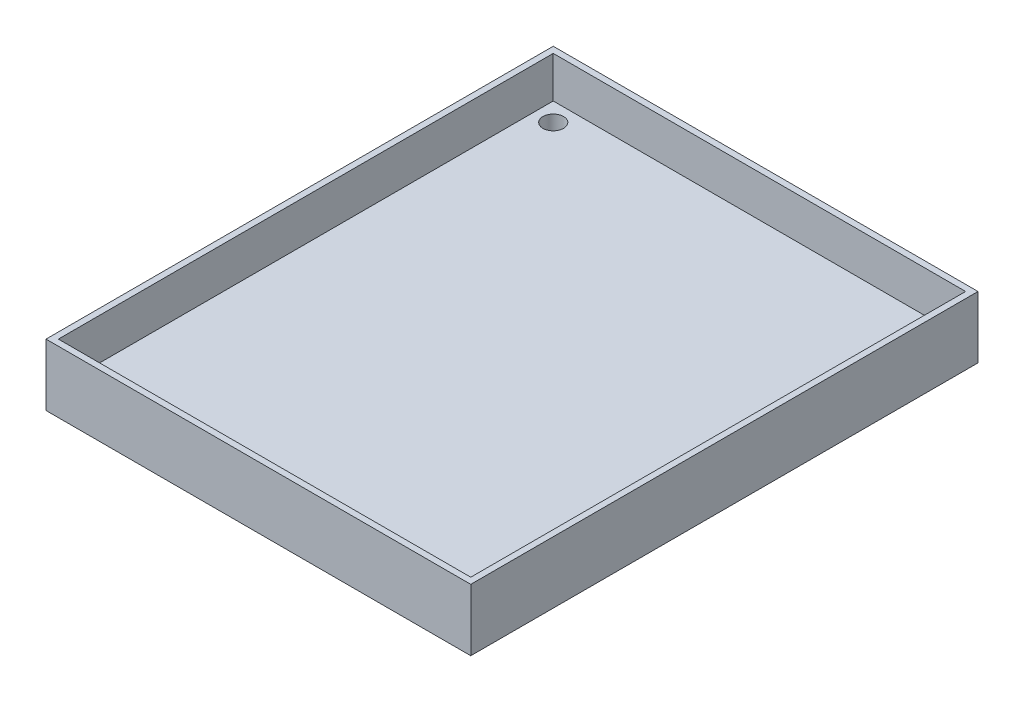
ISO-10303-21;
HEADER;
FILE_DESCRIPTION(('STEP AP214'),'2;1');
FILE_NAME('part.step','',(''),(''),'','','');
FILE_SCHEMA(('AUTOMOTIVE_DESIGN { 1 0 10303 214 1 1 1 1 }'));
ENDSEC;
DATA;
#1=APPLICATION_CONTEXT('core data for automotive mechanical design processes');
#2=APPLICATION_PROTOCOL_DEFINITION('international standard','automotive_design',2000,#1);
#3=PRODUCT_CONTEXT('',#1,'mechanical');
#4=PRODUCT('Part','Part','',(#3));
#5=PRODUCT_RELATED_PRODUCT_CATEGORY('part','',(#4));
#6=PRODUCT_DEFINITION_FORMATION('','',#4);
#7=PRODUCT_DEFINITION_CONTEXT('part definition',#1,'design');
#8=PRODUCT_DEFINITION('design','',#6,#7);
#9=PRODUCT_DEFINITION_SHAPE('','',#8);
#10=(LENGTH_UNIT() NAMED_UNIT(*) SI_UNIT(.MILLI.,.METRE.));
#11=(NAMED_UNIT(*) PLANE_ANGLE_UNIT() SI_UNIT($,.RADIAN.));
#12=(NAMED_UNIT(*) SI_UNIT($,.STERADIAN.) SOLID_ANGLE_UNIT());
#13=UNCERTAINTY_MEASURE_WITH_UNIT(LENGTH_MEASURE(1.E-05),#10,'distance_accuracy_value','');
#14=(GEOMETRIC_REPRESENTATION_CONTEXT(3) GLOBAL_UNCERTAINTY_ASSIGNED_CONTEXT((#13)) GLOBAL_UNIT_ASSIGNED_CONTEXT((#10,
#11,#12)) REPRESENTATION_CONTEXT('',''));
#15=CARTESIAN_POINT('',(0.,0.,0.));
#16=DIRECTION('',(0.,0.,1.));
#17=DIRECTION('',(1.,0.,0.));
#18=AXIS2_PLACEMENT_3D('',#15,#16,#17);
#19=CARTESIAN_POINT('',(103.,60.,-123.));
#20=DIRECTION('',(-1.,0.,0.));
#21=DIRECTION('',(0.,0.,1.));
#22=AXIS2_PLACEMENT_3D('',#19,#20,#21);
#23=PLANE('',#22);
#24=DIRECTION('',(0.,0.,-1.));
#25=VECTOR('',#24,1.);
#26=CARTESIAN_POINT('',(103.,30.,-123.));
#27=LINE('',#26,#25);
#28=CARTESIAN_POINT('',(103.,30.,123.));
#29=VERTEX_POINT('',#28);
#30=CARTESIAN_POINT('',(103.,30.,-123.));
#31=VERTEX_POINT('',#30);
#32=EDGE_CURVE('E161',#29,#31,#27,.T.);
#33=ORIENTED_EDGE('',*,*,#32,.F.);
#34=DIRECTION('',(0.,-1.,0.));
#35=VECTOR('',#34,1.);
#36=CARTESIAN_POINT('',(103.,60.,123.));
#37=LINE('',#36,#35);
#38=CARTESIAN_POINT('',(103.,0.,123.));
#39=VERTEX_POINT('',#38);
#40=EDGE_CURVE('E221',#29,#39,#37,.T.);
#41=ORIENTED_EDGE('',*,*,#40,.T.);
#42=DIRECTION('',(0.,0.,-1.));
#43=VECTOR('',#42,1.);
#44=CARTESIAN_POINT('',(103.,0.,-123.));
#45=LINE('',#44,#43);
#46=CARTESIAN_POINT('',(103.,0.,-123.));
#47=VERTEX_POINT('',#46);
#48=EDGE_CURVE('E201',#39,#47,#45,.T.);
#49=ORIENTED_EDGE('',*,*,#48,.T.);
#50=DIRECTION('',(0.,-1.,0.));
#51=VECTOR('',#50,1.);
#52=CARTESIAN_POINT('',(103.,60.,-123.));
#53=LINE('',#52,#51);
#54=EDGE_CURVE('E40',#31,#47,#53,.T.);
#55=ORIENTED_EDGE('',*,*,#54,.F.);
#56=EDGE_LOOP('',(#33,#41,#49,#55));
#57=FACE_BOUND('',#56,.T.);
#58=ADVANCED_FACE('F33',(#57),#23,.F.);
#59=CARTESIAN_POINT('',(-103.,60.,-123.));
#60=DIRECTION('',(0.,0.,1.));
#61=DIRECTION('',(1.,0.,0.));
#62=AXIS2_PLACEMENT_3D('',#59,#60,#61);
#63=PLANE('',#62);
#64=DIRECTION('',(-1.,0.,0.));
#65=VECTOR('',#64,1.);
#66=CARTESIAN_POINT('',(-103.,30.,-123.));
#67=LINE('',#66,#65);
#68=CARTESIAN_POINT('',(-103.,30.,-123.));
#69=VERTEX_POINT('',#68);
#70=EDGE_CURVE('E163',#31,#69,#67,.T.);
#71=ORIENTED_EDGE('',*,*,#70,.F.);
#72=ORIENTED_EDGE('',*,*,#54,.T.);
#73=DIRECTION('',(-1.,0.,0.));
#74=VECTOR('',#73,1.);
#75=CARTESIAN_POINT('',(-103.,0.,-123.));
#76=LINE('',#75,#74);
#77=CARTESIAN_POINT('',(-103.,0.,-123.));
#78=VERTEX_POINT('',#77);
#79=EDGE_CURVE('E212',#47,#78,#76,.T.);
#80=ORIENTED_EDGE('',*,*,#79,.T.);
#81=DIRECTION('',(0.,-1.,0.));
#82=VECTOR('',#81,1.);
#83=CARTESIAN_POINT('',(-103.,60.,-123.));
#84=LINE('',#83,#82);
#85=EDGE_CURVE('E225',#69,#78,#84,.T.);
#86=ORIENTED_EDGE('',*,*,#85,.F.);
#87=EDGE_LOOP('',(#71,#72,#80,#86));
#88=FACE_BOUND('',#87,.T.);
#89=ADVANCED_FACE('F284',(#88),#63,.F.);
#90=CARTESIAN_POINT('',(-103.,60.,-123.));
#91=DIRECTION('',(1.,0.,0.));
#92=DIRECTION('',(0.,0.,-1.));
#93=AXIS2_PLACEMENT_3D('',#90,#91,#92);
#94=PLANE('',#93);
#95=DIRECTION('',(0.,0.,1.));
#96=VECTOR('',#95,1.);
#97=CARTESIAN_POINT('',(-103.,30.,-123.));
#98=LINE('',#97,#96);
#99=CARTESIAN_POINT('',(-103.,30.,123.));
#100=VERTEX_POINT('',#99);
#101=EDGE_CURVE('E55',#69,#100,#98,.T.);
#102=ORIENTED_EDGE('',*,*,#101,.F.);
#103=ORIENTED_EDGE('',*,*,#85,.T.);
#104=DIRECTION('',(0.,0.,1.));
#105=VECTOR('',#104,1.);
#106=CARTESIAN_POINT('',(-103.,0.,-123.));
#107=LINE('',#106,#105);
#108=CARTESIAN_POINT('',(-103.,0.,123.));
#109=VERTEX_POINT('',#108);
#110=EDGE_CURVE('E215',#78,#109,#107,.T.);
#111=ORIENTED_EDGE('',*,*,#110,.T.);
#112=DIRECTION('',(0.,-1.,0.));
#113=VECTOR('',#112,1.);
#114=CARTESIAN_POINT('',(-103.,60.,123.));
#115=LINE('',#114,#113);
#116=EDGE_CURVE('E223',#100,#109,#115,.T.);
#117=ORIENTED_EDGE('',*,*,#116,.F.);
#118=EDGE_LOOP('',(#102,#103,#111,#117));
#119=FACE_BOUND('',#118,.T.);
#120=ADVANCED_FACE('F290',(#119),#94,.F.);
#121=CARTESIAN_POINT('',(-103.,60.,123.));
#122=DIRECTION('',(0.,0.,-1.));
#123=DIRECTION('',(-1.,0.,0.));
#124=AXIS2_PLACEMENT_3D('',#121,#122,#123);
#125=PLANE('',#124);
#126=DIRECTION('',(1.,0.,0.));
#127=VECTOR('',#126,1.);
#128=CARTESIAN_POINT('',(-103.,30.,123.));
#129=LINE('',#128,#127);
#130=EDGE_CURVE('E159',#100,#29,#129,.T.);
#131=ORIENTED_EDGE('',*,*,#130,.F.);
#132=ORIENTED_EDGE('',*,*,#116,.T.);
#133=DIRECTION('',(1.,0.,0.));
#134=VECTOR('',#133,1.);
#135=CARTESIAN_POINT('',(-103.,0.,123.));
#136=LINE('',#135,#134);
#137=EDGE_CURVE('E218',#109,#39,#136,.T.);
#138=ORIENTED_EDGE('',*,*,#137,.T.);
#139=ORIENTED_EDGE('',*,*,#40,.F.);
#140=EDGE_LOOP('',(#131,#132,#138,#139));
#141=FACE_BOUND('',#140,.T.);
#142=ADVANCED_FACE('F297',(#141),#125,.F.);
#143=CARTESIAN_POINT('',(100.,10.,-120.));
#144=DIRECTION('',(1.,0.,0.));
#145=DIRECTION('',(0.,0.,-1.));
#146=AXIS2_PLACEMENT_3D('',#143,#144,#145);
#147=PLANE('',#146);
#148=DIRECTION('',(0.,0.,1.));
#149=VECTOR('',#148,1.);
#150=CARTESIAN_POINT('',(100.,30.,-120.));
#151=LINE('',#150,#149);
#152=CARTESIAN_POINT('',(100.,30.,-120.));
#153=VERTEX_POINT('',#152);
#154=CARTESIAN_POINT('',(100.,30.,120.));
#155=VERTEX_POINT('',#154);
#156=EDGE_CURVE('E169',#153,#155,#151,.T.);
#157=ORIENTED_EDGE('',*,*,#156,.F.);
#158=DIRECTION('',(0.,1.,0.));
#159=VECTOR('',#158,1.);
#160=CARTESIAN_POINT('',(100.,10.,-120.));
#161=LINE('',#160,#159);
#162=CARTESIAN_POINT('',(100.,10.,-120.));
#163=VERTEX_POINT('',#162);
#164=EDGE_CURVE('E197',#163,#153,#161,.T.);
#165=ORIENTED_EDGE('',*,*,#164,.F.);
#166=DIRECTION('',(0.,0.,-1.));
#167=VECTOR('',#166,1.);
#168=CARTESIAN_POINT('',(100.,10.,-120.));
#169=LINE('',#168,#167);
#170=CARTESIAN_POINT('',(100.,10.,120.));
#171=VERTEX_POINT('',#170);
#172=EDGE_CURVE('E184',#171,#163,#169,.T.);
#173=ORIENTED_EDGE('',*,*,#172,.F.);
#174=DIRECTION('',(0.,1.,0.));
#175=VECTOR('',#174,1.);
#176=CARTESIAN_POINT('',(100.,10.,120.));
#177=LINE('',#176,#175);
#178=EDGE_CURVE('E198',#171,#155,#177,.T.);
#179=ORIENTED_EDGE('',*,*,#178,.T.);
#180=EDGE_LOOP('',(#157,#165,#173,#179));
#181=FACE_BOUND('',#180,.T.);
#182=ADVANCED_FACE('F258',(#181),#147,.F.);
#183=CARTESIAN_POINT('',(-100.,10.,120.));
#184=DIRECTION('',(0.,0.,1.));
#185=DIRECTION('',(1.,0.,0.));
#186=AXIS2_PLACEMENT_3D('',#183,#184,#185);
#187=PLANE('',#186);
#188=DIRECTION('',(-1.,0.,0.));
#189=VECTOR('',#188,1.);
#190=CARTESIAN_POINT('',(-100.,30.,120.));
#191=LINE('',#190,#189);
#192=CARTESIAN_POINT('',(-100.,30.,120.));
#193=VERTEX_POINT('',#192);
#194=EDGE_CURVE('E167',#155,#193,#191,.T.);
#195=ORIENTED_EDGE('',*,*,#194,.F.);
#196=ORIENTED_EDGE('',*,*,#178,.F.);
#197=DIRECTION('',(1.,0.,0.));
#198=VECTOR('',#197,1.);
#199=CARTESIAN_POINT('',(-100.,10.,120.));
#200=LINE('',#199,#198);
#201=CARTESIAN_POINT('',(-100.,10.,120.));
#202=VERTEX_POINT('',#201);
#203=EDGE_CURVE('E194',#202,#171,#200,.T.);
#204=ORIENTED_EDGE('',*,*,#203,.F.);
#205=DIRECTION('',(0.,1.,0.));
#206=VECTOR('',#205,1.);
#207=CARTESIAN_POINT('',(-100.,10.,120.));
#208=LINE('',#207,#206);
#209=EDGE_CURVE('E202',#202,#193,#208,.T.);
#210=ORIENTED_EDGE('',*,*,#209,.T.);
#211=EDGE_LOOP('',(#195,#196,#204,#210));
#212=FACE_BOUND('',#211,.T.);
#213=ADVANCED_FACE('F268',(#212),#187,.F.);
#214=CARTESIAN_POINT('',(-100.,10.,-120.));
#215=DIRECTION('',(-1.,0.,0.));
#216=DIRECTION('',(0.,0.,1.));
#217=AXIS2_PLACEMENT_3D('',#214,#215,#216);
#218=PLANE('',#217);
#219=DIRECTION('',(0.,0.,-1.));
#220=VECTOR('',#219,1.);
#221=CARTESIAN_POINT('',(-100.,30.,-120.));
#222=LINE('',#221,#220);
#223=CARTESIAN_POINT('',(-100.,30.,-120.));
#224=VERTEX_POINT('',#223);
#225=EDGE_CURVE('E165',#193,#224,#222,.T.);
#226=ORIENTED_EDGE('',*,*,#225,.F.);
#227=ORIENTED_EDGE('',*,*,#209,.F.);
#228=DIRECTION('',(0.,0.,1.));
#229=VECTOR('',#228,1.);
#230=CARTESIAN_POINT('',(-100.,10.,-120.));
#231=LINE('',#230,#229);
#232=CARTESIAN_POINT('',(-100.,10.,-120.));
#233=VERTEX_POINT('',#232);
#234=EDGE_CURVE('E191',#233,#202,#231,.T.);
#235=ORIENTED_EDGE('',*,*,#234,.F.);
#236=DIRECTION('',(0.,1.,0.));
#237=VECTOR('',#236,1.);
#238=CARTESIAN_POINT('',(-100.,10.,-120.));
#239=LINE('',#238,#237);
#240=EDGE_CURVE('E205',#233,#224,#239,.T.);
#241=ORIENTED_EDGE('',*,*,#240,.T.);
#242=EDGE_LOOP('',(#226,#227,#235,#241));
#243=FACE_BOUND('',#242,.T.);
#244=ADVANCED_FACE('F265',(#243),#218,.F.);
#245=CARTESIAN_POINT('',(-100.,10.,-120.));
#246=DIRECTION('',(0.,0.,-1.));
#247=DIRECTION('',(-1.,0.,0.));
#248=AXIS2_PLACEMENT_3D('',#245,#246,#247);
#249=PLANE('',#248);
#250=DIRECTION('',(1.,0.,0.));
#251=VECTOR('',#250,1.);
#252=CARTESIAN_POINT('',(-100.,30.,-120.));
#253=LINE('',#252,#251);
#254=EDGE_CURVE('E11',#224,#153,#253,.T.);
#255=ORIENTED_EDGE('',*,*,#254,.F.);
#256=ORIENTED_EDGE('',*,*,#240,.F.);
#257=DIRECTION('',(-1.,0.,0.));
#258=VECTOR('',#257,1.);
#259=CARTESIAN_POINT('',(-100.,10.,-120.));
#260=LINE('',#259,#258);
#261=EDGE_CURVE('E187',#163,#233,#260,.T.);
#262=ORIENTED_EDGE('',*,*,#261,.F.);
#263=ORIENTED_EDGE('',*,*,#164,.T.);
#264=EDGE_LOOP('',(#255,#256,#262,#263));
#265=FACE_BOUND('',#264,.T.);
#266=ADVANCED_FACE('F261',(#265),#249,.F.);
#267=CARTESIAN_POINT('',(0.,0.,0.));
#268=DIRECTION('',(0.,1.,0.));
#269=DIRECTION('',(0.,0.,1.));
#270=AXIS2_PLACEMENT_3D('',#267,#268,#269);
#271=PLANE('',#270);
#272=DIRECTION('',(-1.,0.,0.));
#273=VECTOR('',#272,1.);
#274=CARTESIAN_POINT('',(-65.,0.,30.));
#275=LINE('',#274,#273);
#276=CARTESIAN_POINT('',(65.,0.,30.));
#277=VERTEX_POINT('',#276);
#278=CARTESIAN_POINT('',(-65.,0.,30.));
#279=VERTEX_POINT('',#278);
#280=EDGE_CURVE('E149',#277,#279,#275,.T.);
#281=ORIENTED_EDGE('',*,*,#280,.F.);
#282=DIRECTION('',(0.,0.,1.));
#283=VECTOR('',#282,1.);
#284=CARTESIAN_POINT('',(65.,0.,30.));
#285=LINE('',#284,#283);
#286=CARTESIAN_POINT('',(65.,0.,-30.));
#287=VERTEX_POINT('',#286);
#288=EDGE_CURVE('E47',#287,#277,#285,.T.);
#289=ORIENTED_EDGE('',*,*,#288,.F.);
#290=DIRECTION('',(1.,0.,0.));
#291=VECTOR('',#290,1.);
#292=CARTESIAN_POINT('',(-65.,0.,-30.));
#293=LINE('',#292,#291);
#294=CARTESIAN_POINT('',(-65.,0.,-30.));
#295=VERTEX_POINT('',#294);
#296=EDGE_CURVE('E140',#295,#287,#293,.T.);
#297=ORIENTED_EDGE('',*,*,#296,.F.);
#298=DIRECTION('',(0.,0.,-1.));
#299=VECTOR('',#298,1.);
#300=CARTESIAN_POINT('',(-65.,0.,30.));
#301=LINE('',#300,#299);
#302=EDGE_CURVE('E143',#279,#295,#301,.T.);
#303=ORIENTED_EDGE('',*,*,#302,.F.);
#304=EDGE_LOOP('',(#281,#289,#297,#303));
#305=FACE_BOUND('',#304,.T.);
#306=CARTESIAN_POINT('',(-91.,0.,-111.));
#307=DIRECTION('',(0.,-1.,0.));
#308=DIRECTION('',(0.,0.,-1.));
#309=AXIS2_PLACEMENT_3D('',#306,#307,#308);
#310=CIRCLE('',#309,5.00000000000001);
#311=CARTESIAN_POINT('',(-91.,0.,-116.));
#312=VERTEX_POINT('',#311);
#313=EDGE_CURVE('E171',#312,#312,#310,.T.);
#314=ORIENTED_EDGE('',*,*,#313,.F.);
#315=EDGE_LOOP('',(#314));
#316=FACE_BOUND('',#315,.T.);
#317=CARTESIAN_POINT('',(91.,0.,-111.));
#318=DIRECTION('',(0.,-1.,0.));
#319=DIRECTION('',(0.,0.,-1.));
#320=AXIS2_PLACEMENT_3D('',#317,#318,#319);
#321=CIRCLE('',#320,5.00000000000001);
#322=CARTESIAN_POINT('',(91.,0.,-116.));
#323=VERTEX_POINT('',#322);
#324=EDGE_CURVE('E176',#323,#323,#321,.T.);
#325=ORIENTED_EDGE('',*,*,#324,.F.);
#326=EDGE_LOOP('',(#325));
#327=FACE_BOUND('',#326,.T.);
#328=CARTESIAN_POINT('',(91.,0.,111.));
#329=DIRECTION('',(0.,-1.,0.));
#330=DIRECTION('',(0.,0.,-1.));
#331=AXIS2_PLACEMENT_3D('',#328,#329,#330);
#332=CIRCLE('',#331,5.00000000000001);
#333=CARTESIAN_POINT('',(91.,0.,106.));
#334=VERTEX_POINT('',#333);
#335=EDGE_CURVE('E172',#334,#334,#332,.T.);
#336=ORIENTED_EDGE('',*,*,#335,.F.);
#337=EDGE_LOOP('',(#336));
#338=FACE_BOUND('',#337,.T.);
#339=CARTESIAN_POINT('',(-91.,0.,111.));
#340=DIRECTION('',(0.,-1.,0.));
#341=DIRECTION('',(0.,0.,-1.));
#342=AXIS2_PLACEMENT_3D('',#339,#340,#341);
#343=CIRCLE('',#342,5.00000000000001);
#344=CARTESIAN_POINT('',(-91.,0.,106.));
#345=VERTEX_POINT('',#344);
#346=EDGE_CURVE('E175',#345,#345,#343,.T.);
#347=ORIENTED_EDGE('',*,*,#346,.F.);
#348=EDGE_LOOP('',(#347));
#349=FACE_BOUND('',#348,.T.);
#350=ORIENTED_EDGE('',*,*,#48,.F.);
#351=ORIENTED_EDGE('',*,*,#137,.F.);
#352=ORIENTED_EDGE('',*,*,#110,.F.);
#353=ORIENTED_EDGE('',*,*,#79,.F.);
#354=EDGE_LOOP('',(#350,#351,#352,#353));
#355=FACE_BOUND('',#354,.T.);
#356=ADVANCED_FACE('F245',(#305,#316,#327,#338,#349,#355),#271,.F.);
#357=CARTESIAN_POINT('',(0.,10.,0.));
#358=DIRECTION('',(0.,1.,0.));
#359=DIRECTION('',(0.,0.,1.));
#360=AXIS2_PLACEMENT_3D('',#357,#358,#359);
#361=PLANE('',#360);
#362=CARTESIAN_POINT('',(-91.,10.,-111.));
#363=DIRECTION('',(0.,1.,0.));
#364=DIRECTION('',(0.,0.,1.));
#365=AXIS2_PLACEMENT_3D('',#362,#363,#364);
#366=CIRCLE('',#365,5.00000000000001);
#367=CARTESIAN_POINT('',(-91.,10.,-106.));
#368=VERTEX_POINT('',#367);
#369=EDGE_CURVE('E188',#368,#368,#366,.T.);
#370=ORIENTED_EDGE('',*,*,#369,.F.);
#371=EDGE_LOOP('',(#370));
#372=FACE_BOUND('',#371,.T.);
#373=CARTESIAN_POINT('',(91.,10.,-111.));
#374=DIRECTION('',(0.,1.,0.));
#375=DIRECTION('',(0.,0.,1.));
#376=AXIS2_PLACEMENT_3D('',#373,#374,#375);
#377=CIRCLE('',#376,5.00000000000001);
#378=CARTESIAN_POINT('',(91.,10.,-106.));
#379=VERTEX_POINT('',#378);
#380=EDGE_CURVE('E233',#379,#379,#377,.T.);
#381=ORIENTED_EDGE('',*,*,#380,.F.);
#382=EDGE_LOOP('',(#381));
#383=FACE_BOUND('',#382,.T.);
#384=CARTESIAN_POINT('',(91.,10.,111.));
#385=DIRECTION('',(0.,1.,0.));
#386=DIRECTION('',(0.,0.,1.));
#387=AXIS2_PLACEMENT_3D('',#384,#385,#386);
#388=CIRCLE('',#387,5.00000000000001);
#389=CARTESIAN_POINT('',(91.,10.,116.));
#390=VERTEX_POINT('',#389);
#391=EDGE_CURVE('E230',#390,#390,#388,.T.);
#392=ORIENTED_EDGE('',*,*,#391,.F.);
#393=EDGE_LOOP('',(#392));
#394=FACE_BOUND('',#393,.T.);
#395=CARTESIAN_POINT('',(-91.,10.,111.));
#396=DIRECTION('',(0.,1.,0.));
#397=DIRECTION('',(0.,0.,1.));
#398=AXIS2_PLACEMENT_3D('',#395,#396,#397);
#399=CIRCLE('',#398,5.00000000000001);
#400=CARTESIAN_POINT('',(-91.,10.,116.));
#401=VERTEX_POINT('',#400);
#402=EDGE_CURVE('E183',#401,#401,#399,.T.);
#403=ORIENTED_EDGE('',*,*,#402,.F.);
#404=EDGE_LOOP('',(#403));
#405=FACE_BOUND('',#404,.T.);
#406=ORIENTED_EDGE('',*,*,#172,.T.);
#407=ORIENTED_EDGE('',*,*,#261,.T.);
#408=ORIENTED_EDGE('',*,*,#234,.T.);
#409=ORIENTED_EDGE('',*,*,#203,.T.);
#410=EDGE_LOOP('',(#406,#407,#408,#409));
#411=FACE_BOUND('',#410,.T.);
#412=ADVANCED_FACE('F241',(#372,#383,#394,#405,#411),#361,.T.);
#413=CARTESIAN_POINT('',(-91.,60.,111.));
#414=DIRECTION('',(0.,-1.,0.));
#415=DIRECTION('',(0.,0.,-1.));
#416=AXIS2_PLACEMENT_3D('',#413,#414,#415);
#417=CYLINDRICAL_SURFACE('',#416,5.00000000000001);
#418=ORIENTED_EDGE('',*,*,#402,.T.);
#419=EDGE_LOOP('',(#418));
#420=FACE_BOUND('',#419,.T.);
#421=ORIENTED_EDGE('',*,*,#346,.T.);
#422=EDGE_LOOP('',(#421));
#423=FACE_BOUND('',#422,.T.);
#424=ADVANCED_FACE('F244',(#420,#423),#417,.F.);
#425=CARTESIAN_POINT('',(91.,60.,111.));
#426=DIRECTION('',(0.,-1.,0.));
#427=DIRECTION('',(0.,0.,-1.));
#428=AXIS2_PLACEMENT_3D('',#425,#426,#427);
#429=CYLINDRICAL_SURFACE('',#428,5.00000000000001);
#430=ORIENTED_EDGE('',*,*,#391,.T.);
#431=EDGE_LOOP('',(#430));
#432=FACE_BOUND('',#431,.T.);
#433=ORIENTED_EDGE('',*,*,#335,.T.);
#434=EDGE_LOOP('',(#433));
#435=FACE_BOUND('',#434,.T.);
#436=ADVANCED_FACE('F325',(#432,#435),#429,.F.);
#437=CARTESIAN_POINT('',(91.,60.,-111.));
#438=DIRECTION('',(0.,-1.,0.));
#439=DIRECTION('',(0.,0.,-1.));
#440=AXIS2_PLACEMENT_3D('',#437,#438,#439);
#441=CYLINDRICAL_SURFACE('',#440,5.00000000000001);
#442=ORIENTED_EDGE('',*,*,#380,.T.);
#443=EDGE_LOOP('',(#442));
#444=FACE_BOUND('',#443,.T.);
#445=ORIENTED_EDGE('',*,*,#324,.T.);
#446=EDGE_LOOP('',(#445));
#447=FACE_BOUND('',#446,.T.);
#448=ADVANCED_FACE('F280',(#444,#447),#441,.F.);
#449=CARTESIAN_POINT('',(-91.,60.,-111.));
#450=DIRECTION('',(0.,-1.,0.));
#451=DIRECTION('',(0.,0.,-1.));
#452=AXIS2_PLACEMENT_3D('',#449,#450,#451);
#453=CYLINDRICAL_SURFACE('',#452,5.00000000000001);
#454=ORIENTED_EDGE('',*,*,#369,.T.);
#455=EDGE_LOOP('',(#454));
#456=FACE_BOUND('',#455,.T.);
#457=ORIENTED_EDGE('',*,*,#313,.T.);
#458=EDGE_LOOP('',(#457));
#459=FACE_BOUND('',#458,.T.);
#460=ADVANCED_FACE('F238',(#456,#459),#453,.F.);
#461=CARTESIAN_POINT('',(0.,30.,0.));
#462=DIRECTION('',(0.,1.,0.));
#463=DIRECTION('',(0.,0.,1.));
#464=AXIS2_PLACEMENT_3D('',#461,#462,#463);
#465=PLANE('',#464);
#466=ORIENTED_EDGE('',*,*,#101,.T.);
#467=ORIENTED_EDGE('',*,*,#130,.T.);
#468=ORIENTED_EDGE('',*,*,#32,.T.);
#469=ORIENTED_EDGE('',*,*,#70,.T.);
#470=EDGE_LOOP('',(#466,#467,#468,#469));
#471=FACE_BOUND('',#470,.T.);
#472=ORIENTED_EDGE('',*,*,#156,.T.);
#473=ORIENTED_EDGE('',*,*,#194,.T.);
#474=ORIENTED_EDGE('',*,*,#225,.T.);
#475=ORIENTED_EDGE('',*,*,#254,.T.);
#476=EDGE_LOOP('',(#472,#473,#474,#475));
#477=FACE_BOUND('',#476,.T.);
#478=ADVANCED_FACE('F270',(#471,#477),#465,.T.);
#479=CARTESIAN_POINT('',(65.,5.,30.));
#480=DIRECTION('',(1.,0.,0.));
#481=DIRECTION('',(0.,0.,-1.));
#482=AXIS2_PLACEMENT_3D('',#479,#480,#481);
#483=PLANE('',#482);
#484=ORIENTED_EDGE('',*,*,#288,.T.);
#485=DIRECTION('',(0.,-1.,0.));
#486=VECTOR('',#485,1.);
#487=CARTESIAN_POINT('',(65.,5.,30.));
#488=LINE('',#487,#486);
#489=CARTESIAN_POINT('',(65.,5.,30.));
#490=VERTEX_POINT('',#489);
#491=EDGE_CURVE('E118',#490,#277,#488,.T.);
#492=ORIENTED_EDGE('',*,*,#491,.F.);
#493=DIRECTION('',(0.,0.,1.));
#494=VECTOR('',#493,1.);
#495=CARTESIAN_POINT('',(65.,5.,30.));
#496=LINE('',#495,#494);
#497=CARTESIAN_POINT('',(65.,5.,-30.));
#498=VERTEX_POINT('',#497);
#499=EDGE_CURVE('E122',#498,#490,#496,.T.);
#500=ORIENTED_EDGE('',*,*,#499,.F.);
#501=DIRECTION('',(0.,-1.,0.));
#502=VECTOR('',#501,1.);
#503=CARTESIAN_POINT('',(65.,5.,-30.));
#504=LINE('',#503,#502);
#505=EDGE_CURVE('E153',#498,#287,#504,.T.);
#506=ORIENTED_EDGE('',*,*,#505,.T.);
#507=EDGE_LOOP('',(#484,#492,#500,#506));
#508=FACE_BOUND('',#507,.T.);
#509=ADVANCED_FACE('F120',(#508),#483,.F.);
#510=CARTESIAN_POINT('',(-65.,5.,-30.));
#511=DIRECTION('',(0.,0.,-1.));
#512=DIRECTION('',(-1.,0.,0.));
#513=AXIS2_PLACEMENT_3D('',#510,#511,#512);
#514=PLANE('',#513);
#515=ORIENTED_EDGE('',*,*,#296,.T.);
#516=ORIENTED_EDGE('',*,*,#505,.F.);
#517=DIRECTION('',(1.,0.,0.));
#518=VECTOR('',#517,1.);
#519=CARTESIAN_POINT('',(-65.,5.,-30.));
#520=LINE('',#519,#518);
#521=CARTESIAN_POINT('',(-65.,5.,-30.));
#522=VERTEX_POINT('',#521);
#523=EDGE_CURVE('E128',#522,#498,#520,.T.);
#524=ORIENTED_EDGE('',*,*,#523,.F.);
#525=DIRECTION('',(0.,-1.,0.));
#526=VECTOR('',#525,1.);
#527=CARTESIAN_POINT('',(-65.,5.,-30.));
#528=LINE('',#527,#526);
#529=EDGE_CURVE('E155',#522,#295,#528,.T.);
#530=ORIENTED_EDGE('',*,*,#529,.T.);
#531=EDGE_LOOP('',(#515,#516,#524,#530));
#532=FACE_BOUND('',#531,.T.);
#533=ADVANCED_FACE('F277',(#532),#514,.F.);
#534=CARTESIAN_POINT('',(-65.,5.,30.));
#535=DIRECTION('',(-1.,0.,0.));
#536=DIRECTION('',(0.,0.,1.));
#537=AXIS2_PLACEMENT_3D('',#534,#535,#536);
#538=PLANE('',#537);
#539=ORIENTED_EDGE('',*,*,#302,.T.);
#540=ORIENTED_EDGE('',*,*,#529,.F.);
#541=DIRECTION('',(0.,0.,-1.));
#542=VECTOR('',#541,1.);
#543=CARTESIAN_POINT('',(-65.,5.,30.));
#544=LINE('',#543,#542);
#545=CARTESIAN_POINT('',(-65.,5.,30.));
#546=VERTEX_POINT('',#545);
#547=EDGE_CURVE('E136',#546,#522,#544,.T.);
#548=ORIENTED_EDGE('',*,*,#547,.F.);
#549=DIRECTION('',(0.,-1.,0.));
#550=VECTOR('',#549,1.);
#551=CARTESIAN_POINT('',(-65.,5.,30.));
#552=LINE('',#551,#550);
#553=EDGE_CURVE('E127',#546,#279,#552,.T.);
#554=ORIENTED_EDGE('',*,*,#553,.T.);
#555=EDGE_LOOP('',(#539,#540,#548,#554));
#556=FACE_BOUND('',#555,.T.);
#557=ADVANCED_FACE('F403',(#556),#538,.F.);
#558=CARTESIAN_POINT('',(-65.,5.,30.));
#559=DIRECTION('',(0.,0.,1.));
#560=DIRECTION('',(1.,0.,0.));
#561=AXIS2_PLACEMENT_3D('',#558,#559,#560);
#562=PLANE('',#561);
#563=ORIENTED_EDGE('',*,*,#280,.T.);
#564=ORIENTED_EDGE('',*,*,#553,.F.);
#565=DIRECTION('',(-1.,0.,0.));
#566=VECTOR('',#565,1.);
#567=CARTESIAN_POINT('',(-65.,5.,30.));
#568=LINE('',#567,#566);
#569=EDGE_CURVE('E131',#490,#546,#568,.T.);
#570=ORIENTED_EDGE('',*,*,#569,.F.);
#571=ORIENTED_EDGE('',*,*,#491,.T.);
#572=EDGE_LOOP('',(#563,#564,#570,#571));
#573=FACE_BOUND('',#572,.T.);
#574=ADVANCED_FACE('F132',(#573),#562,.F.);
#575=CARTESIAN_POINT('',(0.,5.,0.));
#576=DIRECTION('',(0.,-1.,0.));
#577=DIRECTION('',(0.,0.,-1.));
#578=AXIS2_PLACEMENT_3D('',#575,#576,#577);
#579=PLANE('',#578);
#580=ORIENTED_EDGE('',*,*,#499,.T.);
#581=ORIENTED_EDGE('',*,*,#569,.T.);
#582=ORIENTED_EDGE('',*,*,#547,.T.);
#583=ORIENTED_EDGE('',*,*,#523,.T.);
#584=EDGE_LOOP('',(#580,#581,#582,#583));
#585=FACE_BOUND('',#584,.T.);
#586=ADVANCED_FACE('F138',(#585),#579,.T.);
#587=CLOSED_SHELL('',(#58,#89,#120,#142,#182,#213,#244,#266,#356,#412,#424,#436,#448,#460,#478,
#509,#533,#557,#574,#586));
#588=MANIFOLD_SOLID_BREP('B2',#587);
#589=ADVANCED_BREP_SHAPE_REPRESENTATION('',(#18,#588),#14);
#590=SHAPE_DEFINITION_REPRESENTATION(#9,#589);
ENDSEC;
END-ISO-10303-21;
